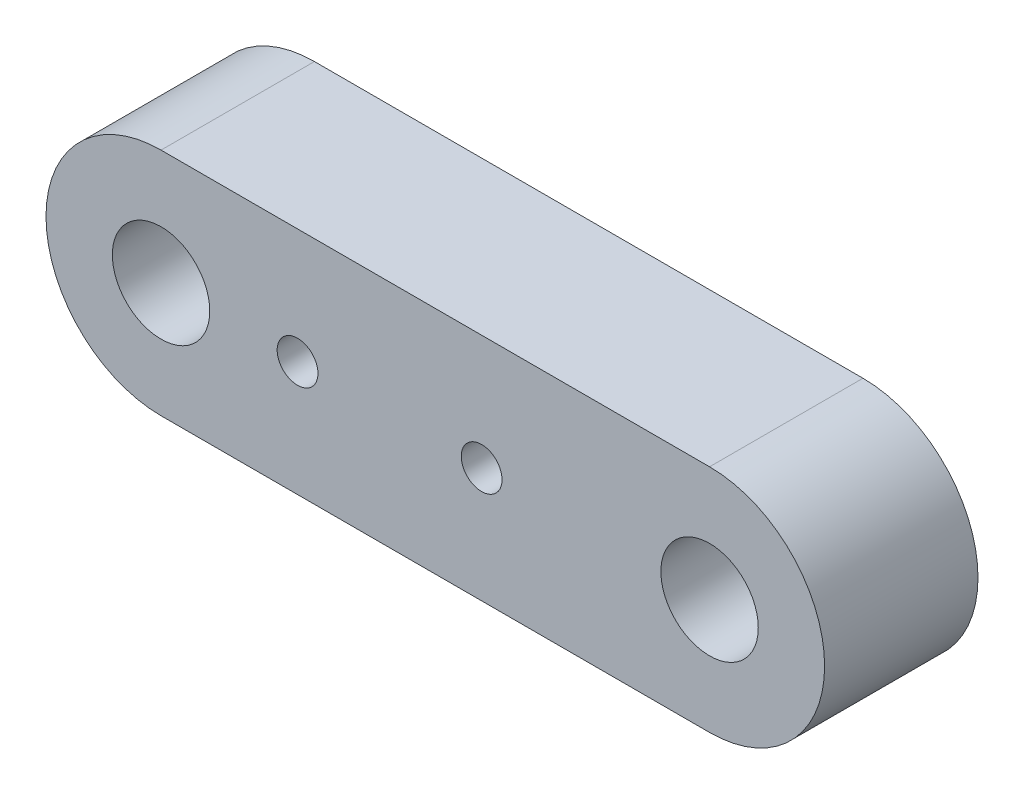
ISO-10303-21;
HEADER;
FILE_DESCRIPTION(('STEP AP214'),'2;1');
FILE_NAME('part.step','',(''),(''),'','','');
FILE_SCHEMA(('AUTOMOTIVE_DESIGN { 1 0 10303 214 1 1 1 1 }'));
ENDSEC;
DATA;
#1=APPLICATION_CONTEXT('core data for automotive mechanical design processes');
#2=APPLICATION_PROTOCOL_DEFINITION('international standard','automotive_design',2000,#1);
#3=PRODUCT_CONTEXT('',#1,'mechanical');
#4=PRODUCT('Part','Part','',(#3));
#5=PRODUCT_RELATED_PRODUCT_CATEGORY('part','',(#4));
#6=PRODUCT_DEFINITION_FORMATION('','',#4);
#7=PRODUCT_DEFINITION_CONTEXT('part definition',#1,'design');
#8=PRODUCT_DEFINITION('design','',#6,#7);
#9=PRODUCT_DEFINITION_SHAPE('','',#8);
#10=(LENGTH_UNIT() NAMED_UNIT(*) SI_UNIT(.MILLI.,.METRE.));
#11=(NAMED_UNIT(*) PLANE_ANGLE_UNIT() SI_UNIT($,.RADIAN.));
#12=(NAMED_UNIT(*) SI_UNIT($,.STERADIAN.) SOLID_ANGLE_UNIT());
#13=UNCERTAINTY_MEASURE_WITH_UNIT(LENGTH_MEASURE(1.E-05),#10,'distance_accuracy_value','');
#14=(GEOMETRIC_REPRESENTATION_CONTEXT(3) GLOBAL_UNCERTAINTY_ASSIGNED_CONTEXT((#13)) GLOBAL_UNIT_ASSIGNED_CONTEXT((#10,
#11,#12)) REPRESENTATION_CONTEXT('',''));
#15=CARTESIAN_POINT('',(0.,0.,0.));
#16=DIRECTION('',(0.,0.,1.));
#17=DIRECTION('',(1.,0.,0.));
#18=AXIS2_PLACEMENT_3D('',#15,#16,#17);
#19=CARTESIAN_POINT('',(-8.94,0.,2.5));
#20=DIRECTION('',(0.,0.,-1.));
#21=DIRECTION('',(-1.,0.,0.));
#22=AXIS2_PLACEMENT_3D('',#19,#20,#21);
#23=CYLINDRICAL_SURFACE('',#22,3.75);
#24=CARTESIAN_POINT('',(-8.94,0.,-2.5));
#25=DIRECTION('',(0.,0.,1.));
#26=DIRECTION('',(1.,0.,0.));
#27=AXIS2_PLACEMENT_3D('',#24,#25,#26);
#28=CIRCLE('',#27,3.75);
#29=CARTESIAN_POINT('',(-8.94,3.75,-2.5));
#30=VERTEX_POINT('',#29);
#31=CARTESIAN_POINT('',(-8.94,-3.75,-2.5));
#32=VERTEX_POINT('',#31);
#33=EDGE_CURVE('E99',#30,#32,#28,.T.);
#34=ORIENTED_EDGE('',*,*,#33,.T.);
#35=DIRECTION('',(0.,0.,-1.));
#36=VECTOR('',#35,1.);
#37=CARTESIAN_POINT('',(-8.94,-3.75,2.5));
#38=LINE('',#37,#36);
#39=CARTESIAN_POINT('',(-8.94,-3.75,2.5));
#40=VERTEX_POINT('',#39);
#41=EDGE_CURVE('E11',#40,#32,#38,.T.);
#42=ORIENTED_EDGE('',*,*,#41,.F.);
#43=CARTESIAN_POINT('',(-8.94,0.,2.5));
#44=DIRECTION('',(0.,0.,1.));
#45=DIRECTION('',(1.,0.,0.));
#46=AXIS2_PLACEMENT_3D('',#43,#44,#45);
#47=CIRCLE('',#46,3.75);
#48=CARTESIAN_POINT('',(-8.94,3.75,2.5));
#49=VERTEX_POINT('',#48);
#50=EDGE_CURVE('E87',#49,#40,#47,.T.);
#51=ORIENTED_EDGE('',*,*,#50,.F.);
#52=DIRECTION('',(0.,0.,-1.));
#53=VECTOR('',#52,1.);
#54=CARTESIAN_POINT('',(-8.94,3.75,2.5));
#55=LINE('',#54,#53);
#56=EDGE_CURVE('E95',#49,#30,#55,.T.);
#57=ORIENTED_EDGE('',*,*,#56,.T.);
#58=EDGE_LOOP('',(#34,#42,#51,#57));
#59=FACE_BOUND('',#58,.T.);
#60=ADVANCED_FACE('F36',(#59),#23,.T.);
#61=CARTESIAN_POINT('',(-8.94,-3.75,2.5));
#62=DIRECTION('',(0.,1.,0.));
#63=DIRECTION('',(0.,0.,1.));
#64=AXIS2_PLACEMENT_3D('',#61,#62,#63);
#65=PLANE('',#64);
#66=DIRECTION('',(1.,0.,0.));
#67=VECTOR('',#66,1.);
#68=CARTESIAN_POINT('',(-8.94,-3.75,-2.5));
#69=LINE('',#68,#67);
#70=CARTESIAN_POINT('',(8.94,-3.75,-2.5));
#71=VERTEX_POINT('',#70);
#72=EDGE_CURVE('E91',#32,#71,#69,.T.);
#73=ORIENTED_EDGE('',*,*,#72,.T.);
#74=DIRECTION('',(0.,0.,-1.));
#75=VECTOR('',#74,1.);
#76=CARTESIAN_POINT('',(8.94,-3.75,2.5));
#77=LINE('',#76,#75);
#78=CARTESIAN_POINT('',(8.94,-3.75,2.5));
#79=VERTEX_POINT('',#78);
#80=EDGE_CURVE('E44',#79,#71,#77,.T.);
#81=ORIENTED_EDGE('',*,*,#80,.F.);
#82=DIRECTION('',(1.,0.,0.));
#83=VECTOR('',#82,1.);
#84=CARTESIAN_POINT('',(-8.94,-3.75,2.5));
#85=LINE('',#84,#83);
#86=EDGE_CURVE('E82',#40,#79,#85,.T.);
#87=ORIENTED_EDGE('',*,*,#86,.F.);
#88=ORIENTED_EDGE('',*,*,#41,.T.);
#89=EDGE_LOOP('',(#73,#81,#87,#88));
#90=FACE_BOUND('',#89,.T.);
#91=ADVANCED_FACE('F90',(#90),#65,.F.);
#92=CARTESIAN_POINT('',(8.94,0.,2.5));
#93=DIRECTION('',(0.,0.,-1.));
#94=DIRECTION('',(-1.,0.,0.));
#95=AXIS2_PLACEMENT_3D('',#92,#93,#94);
#96=CYLINDRICAL_SURFACE('',#95,3.75);
#97=CARTESIAN_POINT('',(8.94,0.,-2.5));
#98=DIRECTION('',(0.,0.,1.));
#99=DIRECTION('',(1.,0.,0.));
#100=AXIS2_PLACEMENT_3D('',#97,#98,#99);
#101=CIRCLE('',#100,3.75);
#102=CARTESIAN_POINT('',(8.94,3.75,-2.5));
#103=VERTEX_POINT('',#102);
#104=EDGE_CURVE('E69',#71,#103,#101,.T.);
#105=ORIENTED_EDGE('',*,*,#104,.T.);
#106=DIRECTION('',(0.,0.,-1.));
#107=VECTOR('',#106,1.);
#108=CARTESIAN_POINT('',(8.94,3.75,2.5));
#109=LINE('',#108,#107);
#110=CARTESIAN_POINT('',(8.94,3.75,2.5));
#111=VERTEX_POINT('',#110);
#112=EDGE_CURVE('E92',#111,#103,#109,.T.);
#113=ORIENTED_EDGE('',*,*,#112,.F.);
#114=CARTESIAN_POINT('',(8.94,0.,2.5));
#115=DIRECTION('',(0.,0.,1.));
#116=DIRECTION('',(1.,0.,0.));
#117=AXIS2_PLACEMENT_3D('',#114,#115,#116);
#118=CIRCLE('',#117,3.75);
#119=EDGE_CURVE('E85',#79,#111,#118,.T.);
#120=ORIENTED_EDGE('',*,*,#119,.F.);
#121=ORIENTED_EDGE('',*,*,#80,.T.);
#122=EDGE_LOOP('',(#105,#113,#120,#121));
#123=FACE_BOUND('',#122,.T.);
#124=ADVANCED_FACE('F93',(#123),#96,.T.);
#125=CARTESIAN_POINT('',(-8.94,3.75,2.5));
#126=DIRECTION('',(0.,-1.,0.));
#127=DIRECTION('',(1.,0.,0.));
#128=AXIS2_PLACEMENT_3D('',#125,#126,#127);
#129=PLANE('',#128);
#130=DIRECTION('',(-1.,0.,0.));
#131=VECTOR('',#130,1.);
#132=CARTESIAN_POINT('',(-8.94,3.75,-2.5));
#133=LINE('',#132,#131);
#134=EDGE_CURVE('E75',#103,#30,#133,.T.);
#135=ORIENTED_EDGE('',*,*,#134,.T.);
#136=ORIENTED_EDGE('',*,*,#56,.F.);
#137=DIRECTION('',(-1.,0.,0.));
#138=VECTOR('',#137,1.);
#139=CARTESIAN_POINT('',(-8.94,3.75,2.5));
#140=LINE('',#139,#138);
#141=EDGE_CURVE('E52',#111,#49,#140,.T.);
#142=ORIENTED_EDGE('',*,*,#141,.F.);
#143=ORIENTED_EDGE('',*,*,#112,.T.);
#144=EDGE_LOOP('',(#135,#136,#142,#143));
#145=FACE_BOUND('',#144,.T.);
#146=ADVANCED_FACE('F107',(#145),#129,.F.);
#147=CARTESIAN_POINT('',(-8.94,0.,2.5));
#148=DIRECTION('',(0.,0.,1.));
#149=DIRECTION('',(1.,0.,0.));
#150=AXIS2_PLACEMENT_3D('',#147,#148,#149);
#151=PLANE('',#150);
#152=CARTESIAN_POINT('',(-4.49,0.,2.5));
#153=DIRECTION('',(0.,0.,1.));
#154=DIRECTION('',(1.,0.,0.));
#155=AXIS2_PLACEMENT_3D('',#152,#153,#154);
#156=CIRCLE('',#155,0.665);
#157=CARTESIAN_POINT('',(-3.825,0.,2.5));
#158=VERTEX_POINT('',#157);
#159=EDGE_CURVE('E128',#158,#158,#156,.T.);
#160=ORIENTED_EDGE('',*,*,#159,.F.);
#161=EDGE_LOOP('',(#160));
#162=FACE_BOUND('',#161,.T.);
#163=CARTESIAN_POINT('',(1.51,0.,2.5));
#164=DIRECTION('',(0.,0.,1.));
#165=DIRECTION('',(1.,0.,0.));
#166=AXIS2_PLACEMENT_3D('',#163,#164,#165);
#167=CIRCLE('',#166,0.665);
#168=CARTESIAN_POINT('',(2.175,0.,2.5));
#169=VERTEX_POINT('',#168);
#170=EDGE_CURVE('E129',#169,#169,#167,.T.);
#171=ORIENTED_EDGE('',*,*,#170,.F.);
#172=EDGE_LOOP('',(#171));
#173=FACE_BOUND('',#172,.T.);
#174=CARTESIAN_POINT('',(-8.94,0.,2.5));
#175=DIRECTION('',(0.,0.,1.));
#176=DIRECTION('',(1.,0.,0.));
#177=AXIS2_PLACEMENT_3D('',#174,#175,#176);
#178=CIRCLE('',#177,1.5875);
#179=CARTESIAN_POINT('',(-7.3525,0.,2.5));
#180=VERTEX_POINT('',#179);
#181=EDGE_CURVE('E120',#180,#180,#178,.T.);
#182=ORIENTED_EDGE('',*,*,#181,.F.);
#183=EDGE_LOOP('',(#182));
#184=FACE_BOUND('',#183,.T.);
#185=CARTESIAN_POINT('',(8.94,0.,2.5));
#186=DIRECTION('',(0.,0.,1.));
#187=DIRECTION('',(1.,0.,0.));
#188=AXIS2_PLACEMENT_3D('',#185,#186,#187);
#189=CIRCLE('',#188,1.5875);
#190=CARTESIAN_POINT('',(10.5275,0.,2.5));
#191=VERTEX_POINT('',#190);
#192=EDGE_CURVE('E113',#191,#191,#189,.T.);
#193=ORIENTED_EDGE('',*,*,#192,.F.);
#194=EDGE_LOOP('',(#193));
#195=FACE_BOUND('',#194,.T.);
#196=ORIENTED_EDGE('',*,*,#50,.T.);
#197=ORIENTED_EDGE('',*,*,#86,.T.);
#198=ORIENTED_EDGE('',*,*,#119,.T.);
#199=ORIENTED_EDGE('',*,*,#141,.T.);
#200=EDGE_LOOP('',(#196,#197,#198,#199));
#201=FACE_BOUND('',#200,.T.);
#202=ADVANCED_FACE('F83',(#162,#173,#184,#195,#201),#151,.T.);
#203=CARTESIAN_POINT('',(-8.94,0.,-2.5));
#204=DIRECTION('',(0.,0.,1.));
#205=DIRECTION('',(1.,0.,0.));
#206=AXIS2_PLACEMENT_3D('',#203,#204,#205);
#207=PLANE('',#206);
#208=CARTESIAN_POINT('',(-4.49,0.,-2.5));
#209=DIRECTION('',(0.,0.,1.));
#210=DIRECTION('',(1.,0.,0.));
#211=AXIS2_PLACEMENT_3D('',#208,#209,#210);
#212=CIRCLE('',#211,0.665);
#213=CARTESIAN_POINT('',(-3.825,0.,-2.5));
#214=VERTEX_POINT('',#213);
#215=EDGE_CURVE('E117',#214,#214,#212,.F.);
#216=ORIENTED_EDGE('',*,*,#215,.F.);
#217=EDGE_LOOP('',(#216));
#218=FACE_BOUND('',#217,.T.);
#219=CARTESIAN_POINT('',(1.51,0.,-2.5));
#220=DIRECTION('',(0.,0.,1.));
#221=DIRECTION('',(1.,0.,0.));
#222=AXIS2_PLACEMENT_3D('',#219,#220,#221);
#223=CIRCLE('',#222,0.665);
#224=CARTESIAN_POINT('',(2.175,0.,-2.5));
#225=VERTEX_POINT('',#224);
#226=EDGE_CURVE('E125',#225,#225,#223,.F.);
#227=ORIENTED_EDGE('',*,*,#226,.F.);
#228=EDGE_LOOP('',(#227));
#229=FACE_BOUND('',#228,.T.);
#230=CARTESIAN_POINT('',(-8.94,0.,-2.5));
#231=DIRECTION('',(0.,0.,1.));
#232=DIRECTION('',(1.,0.,0.));
#233=AXIS2_PLACEMENT_3D('',#230,#231,#232);
#234=CIRCLE('',#233,1.5875);
#235=CARTESIAN_POINT('',(-7.3525,0.,-2.5));
#236=VERTEX_POINT('',#235);
#237=EDGE_CURVE('E102',#236,#236,#234,.T.);
#238=ORIENTED_EDGE('',*,*,#237,.T.);
#239=EDGE_LOOP('',(#238));
#240=FACE_BOUND('',#239,.T.);
#241=CARTESIAN_POINT('',(8.94,0.,-2.5));
#242=DIRECTION('',(0.,0.,1.));
#243=DIRECTION('',(1.,0.,0.));
#244=AXIS2_PLACEMENT_3D('',#241,#242,#243);
#245=CIRCLE('',#244,1.5875);
#246=CARTESIAN_POINT('',(10.5275,0.,-2.5));
#247=VERTEX_POINT('',#246);
#248=EDGE_CURVE('E116',#247,#247,#245,.T.);
#249=ORIENTED_EDGE('',*,*,#248,.T.);
#250=EDGE_LOOP('',(#249));
#251=FACE_BOUND('',#250,.T.);
#252=ORIENTED_EDGE('',*,*,#33,.F.);
#253=ORIENTED_EDGE('',*,*,#134,.F.);
#254=ORIENTED_EDGE('',*,*,#104,.F.);
#255=ORIENTED_EDGE('',*,*,#72,.F.);
#256=EDGE_LOOP('',(#252,#253,#254,#255));
#257=FACE_BOUND('',#256,.T.);
#258=ADVANCED_FACE('F110',(#218,#229,#240,#251,#257),#207,.F.);
#259=CARTESIAN_POINT('',(8.94,0.,-2.5));
#260=DIRECTION('',(0.,0.,1.));
#261=DIRECTION('',(1.,0.,0.));
#262=AXIS2_PLACEMENT_3D('',#259,#260,#261);
#263=CYLINDRICAL_SURFACE('',#262,1.5875);
#264=ORIENTED_EDGE('',*,*,#248,.F.);
#265=EDGE_LOOP('',(#264));
#266=FACE_BOUND('',#265,.T.);
#267=ORIENTED_EDGE('',*,*,#192,.T.);
#268=EDGE_LOOP('',(#267));
#269=FACE_BOUND('',#268,.T.);
#270=ADVANCED_FACE('F149',(#266,#269),#263,.F.);
#271=CARTESIAN_POINT('',(-8.94,0.,-2.5));
#272=DIRECTION('',(0.,0.,1.));
#273=DIRECTION('',(1.,0.,0.));
#274=AXIS2_PLACEMENT_3D('',#271,#272,#273);
#275=CYLINDRICAL_SURFACE('',#274,1.5875);
#276=ORIENTED_EDGE('',*,*,#237,.F.);
#277=EDGE_LOOP('',(#276));
#278=FACE_BOUND('',#277,.T.);
#279=ORIENTED_EDGE('',*,*,#181,.T.);
#280=EDGE_LOOP('',(#279));
#281=FACE_BOUND('',#280,.T.);
#282=ADVANCED_FACE('F151',(#278,#281),#275,.F.);
#283=CARTESIAN_POINT('',(1.51,0.,-2.501));
#284=DIRECTION('',(0.,0.,1.));
#285=DIRECTION('',(1.,0.,0.));
#286=AXIS2_PLACEMENT_3D('',#283,#284,#285);
#287=CYLINDRICAL_SURFACE('',#286,0.665);
#288=ORIENTED_EDGE('',*,*,#170,.T.);
#289=EDGE_LOOP('',(#288));
#290=FACE_BOUND('',#289,.T.);
#291=ORIENTED_EDGE('',*,*,#226,.T.);
#292=EDGE_LOOP('',(#291));
#293=FACE_BOUND('',#292,.T.);
#294=ADVANCED_FACE('F158',(#290,#293),#287,.F.);
#295=CARTESIAN_POINT('',(-4.49,0.,-2.501));
#296=DIRECTION('',(0.,0.,1.));
#297=DIRECTION('',(1.,0.,0.));
#298=AXIS2_PLACEMENT_3D('',#295,#296,#297);
#299=CYLINDRICAL_SURFACE('',#298,0.665);
#300=ORIENTED_EDGE('',*,*,#159,.T.);
#301=EDGE_LOOP('',(#300));
#302=FACE_BOUND('',#301,.T.);
#303=ORIENTED_EDGE('',*,*,#215,.T.);
#304=EDGE_LOOP('',(#303));
#305=FACE_BOUND('',#304,.T.);
#306=ADVANCED_FACE('F137',(#302,#305),#299,.F.);
#307=CLOSED_SHELL('',(#60,#91,#124,#146,#202,#258,#270,#282,#294,#306));
#308=MANIFOLD_SOLID_BREP('B2',#307);
#309=ADVANCED_BREP_SHAPE_REPRESENTATION('',(#18,#308),#14);
#310=SHAPE_DEFINITION_REPRESENTATION(#9,#309);
ENDSEC;
END-ISO-10303-21;
